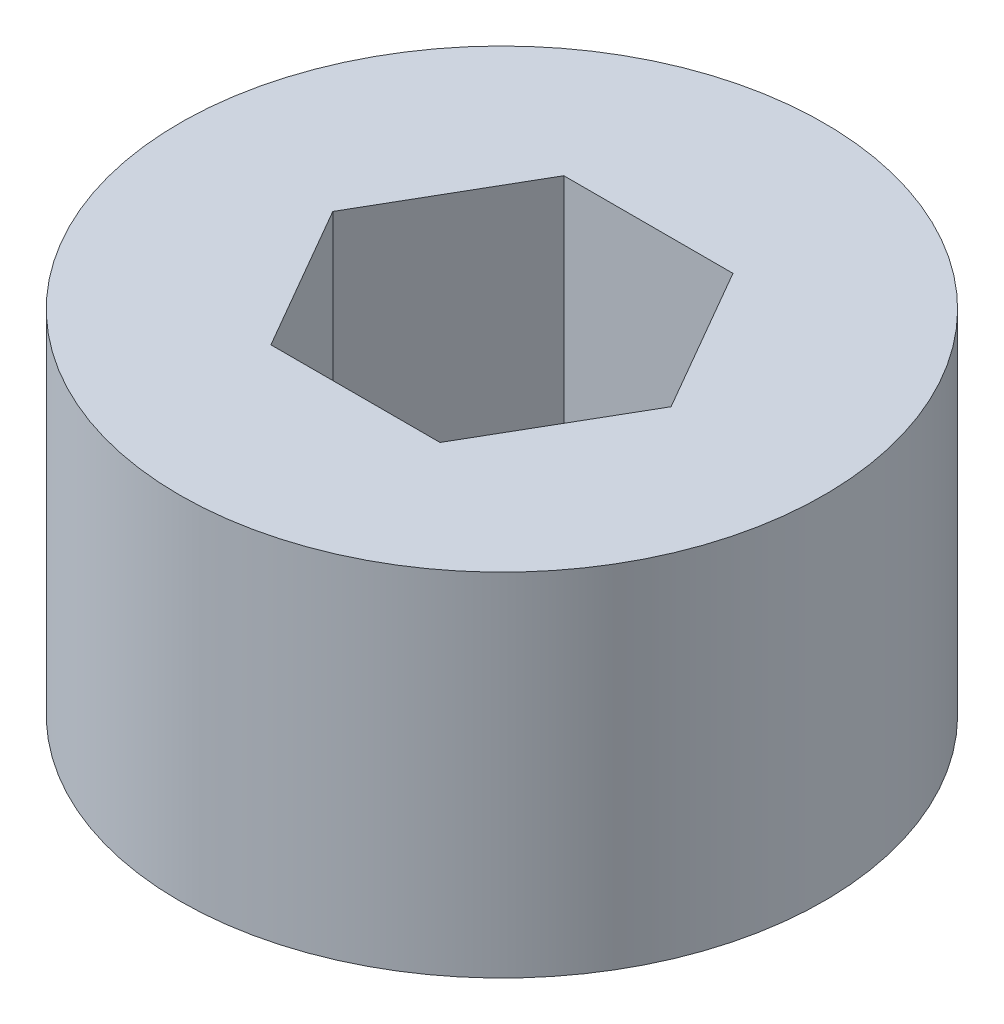
ISO-10303-21;
HEADER;
FILE_DESCRIPTION(('STEP AP214'),'2;1');
FILE_NAME('part.step','',(''),(''),'','','');
FILE_SCHEMA(('AUTOMOTIVE_DESIGN { 1 0 10303 214 1 1 1 1 }'));
ENDSEC;
DATA;
#1=APPLICATION_CONTEXT('core data for automotive mechanical design processes');
#2=APPLICATION_PROTOCOL_DEFINITION('international standard','automotive_design',2000,#1);
#3=PRODUCT_CONTEXT('',#1,'mechanical');
#4=PRODUCT('Part','Part','',(#3));
#5=PRODUCT_RELATED_PRODUCT_CATEGORY('part','',(#4));
#6=PRODUCT_DEFINITION_FORMATION('','',#4);
#7=PRODUCT_DEFINITION_CONTEXT('part definition',#1,'design');
#8=PRODUCT_DEFINITION('design','',#6,#7);
#9=PRODUCT_DEFINITION_SHAPE('','',#8);
#10=(LENGTH_UNIT() NAMED_UNIT(*) SI_UNIT(.MILLI.,.METRE.));
#11=(NAMED_UNIT(*) PLANE_ANGLE_UNIT() SI_UNIT($,.RADIAN.));
#12=(NAMED_UNIT(*) SI_UNIT($,.STERADIAN.) SOLID_ANGLE_UNIT());
#13=UNCERTAINTY_MEASURE_WITH_UNIT(LENGTH_MEASURE(1.E-05),#10,'distance_accuracy_value','');
#14=(GEOMETRIC_REPRESENTATION_CONTEXT(3) GLOBAL_UNCERTAINTY_ASSIGNED_CONTEXT((#13)) GLOBAL_UNIT_ASSIGNED_CONTEXT((#10,
#11,#12)) REPRESENTATION_CONTEXT('',''));
#15=CARTESIAN_POINT('',(0.,0.,0.));
#16=DIRECTION('',(0.,0.,1.));
#17=DIRECTION('',(1.,0.,0.));
#18=AXIS2_PLACEMENT_3D('',#15,#16,#17);
#19=CARTESIAN_POINT('',(0.,3.,0.));
#20=DIRECTION('',(0.,1.,0.));
#21=DIRECTION('',(0.,0.,1.));
#22=AXIS2_PLACEMENT_3D('',#19,#20,#21);
#23=PLANE('',#22);
#24=CARTESIAN_POINT('',(0.,3.,0.));
#25=DIRECTION('',(0.,1.,0.));
#26=DIRECTION('',(0.,0.,1.));
#27=AXIS2_PLACEMENT_3D('',#24,#25,#26);
#28=CIRCLE('',#27,2.75);
#29=CARTESIAN_POINT('',(0.,3.,2.75));
#30=VERTEX_POINT('',#29);
#31=EDGE_CURVE('E11',#30,#30,#28,.T.);
#32=ORIENTED_EDGE('',*,*,#31,.T.);
#33=EDGE_LOOP('',(#32));
#34=FACE_BOUND('',#33,.T.);
#35=DIRECTION('',(1.,0.,0.));
#36=VECTOR('',#35,1.);
#37=CARTESIAN_POINT('',(0.,3.,-1.25));
#38=LINE('',#37,#36);
#39=CARTESIAN_POINT('',(-0.721687836487033,3.,-1.25));
#40=VERTEX_POINT('',#39);
#41=CARTESIAN_POINT('',(0.721687836487032,3.,-1.25));
#42=VERTEX_POINT('',#41);
#43=EDGE_CURVE('E146',#40,#42,#38,.T.);
#44=ORIENTED_EDGE('',*,*,#43,.T.);
#45=DIRECTION('',(0.5,0.,0.866025403784439));
#46=VECTOR('',#45,1.);
#47=CARTESIAN_POINT('',(1.08253175473055,3.,-0.625));
#48=LINE('',#47,#46);
#49=CARTESIAN_POINT('',(1.44337567297406,3.,0.));
#50=VERTEX_POINT('',#49);
#51=EDGE_CURVE('E99',#42,#50,#48,.T.);
#52=ORIENTED_EDGE('',*,*,#51,.T.);
#53=DIRECTION('',(-0.5,0.,0.866025403784439));
#54=VECTOR('',#53,1.);
#55=CARTESIAN_POINT('',(1.08253175473055,3.,0.625));
#56=LINE('',#55,#54);
#57=CARTESIAN_POINT('',(0.721687836487032,3.,1.25));
#58=VERTEX_POINT('',#57);
#59=EDGE_CURVE('E102',#50,#58,#56,.T.);
#60=ORIENTED_EDGE('',*,*,#59,.T.);
#61=DIRECTION('',(-1.,0.,0.));
#62=VECTOR('',#61,1.);
#63=CARTESIAN_POINT('',(0.,3.,1.25));
#64=LINE('',#63,#62);
#65=CARTESIAN_POINT('',(-0.721687836487032,3.,1.25));
#66=VERTEX_POINT('',#65);
#67=EDGE_CURVE('E137',#58,#66,#64,.T.);
#68=ORIENTED_EDGE('',*,*,#67,.T.);
#69=DIRECTION('',(-0.5,0.,-0.866025403784439));
#70=VECTOR('',#69,1.);
#71=CARTESIAN_POINT('',(-1.08253175473055,3.,0.625));
#72=LINE('',#71,#70);
#73=CARTESIAN_POINT('',(-1.44337567297406,3.,0.));
#74=VERTEX_POINT('',#73);
#75=EDGE_CURVE('E140',#66,#74,#72,.T.);
#76=ORIENTED_EDGE('',*,*,#75,.T.);
#77=DIRECTION('',(0.5,0.,-0.866025403784439));
#78=VECTOR('',#77,1.);
#79=CARTESIAN_POINT('',(-1.08253175473055,3.,-0.625));
#80=LINE('',#79,#78);
#81=EDGE_CURVE('E143',#74,#40,#80,.T.);
#82=ORIENTED_EDGE('',*,*,#81,.T.);
#83=EDGE_LOOP('',(#44,#52,#60,#68,#76,#82));
#84=FACE_BOUND('',#83,.T.);
#85=ADVANCED_FACE('F43',(#34,#84),#23,.T.);
#86=CARTESIAN_POINT('',(0.,0.,0.));
#87=DIRECTION('',(0.,1.,0.));
#88=DIRECTION('',(0.,0.,1.));
#89=AXIS2_PLACEMENT_3D('',#86,#87,#88);
#90=PLANE('',#89);
#91=CARTESIAN_POINT('',(0.,0.,0.));
#92=DIRECTION('',(0.,1.,0.));
#93=DIRECTION('',(0.,0.,1.));
#94=AXIS2_PLACEMENT_3D('',#91,#92,#93);
#95=CIRCLE('',#94,2.75);
#96=CARTESIAN_POINT('',(0.,0.,2.75));
#97=VERTEX_POINT('',#96);
#98=EDGE_CURVE('E47',#97,#97,#95,.T.);
#99=ORIENTED_EDGE('',*,*,#98,.F.);
#100=EDGE_LOOP('',(#99));
#101=FACE_BOUND('',#100,.T.);
#102=DIRECTION('',(-0.5,0.,-0.866025403784439));
#103=VECTOR('',#102,1.);
#104=CARTESIAN_POINT('',(1.44337567297406,0.,0.));
#105=LINE('',#104,#103);
#106=CARTESIAN_POINT('',(1.44337567297406,0.,0.));
#107=VERTEX_POINT('',#106);
#108=CARTESIAN_POINT('',(0.721687836487032,0.,-1.25));
#109=VERTEX_POINT('',#108);
#110=EDGE_CURVE('E66',#107,#109,#105,.T.);
#111=ORIENTED_EDGE('',*,*,#110,.T.);
#112=DIRECTION('',(-1.,0.,0.));
#113=VECTOR('',#112,1.);
#114=CARTESIAN_POINT('',(0.721687836487032,0.,-1.25));
#115=LINE('',#114,#113);
#116=CARTESIAN_POINT('',(-0.721687836487033,0.,-1.25));
#117=VERTEX_POINT('',#116);
#118=EDGE_CURVE('E106',#109,#117,#115,.T.);
#119=ORIENTED_EDGE('',*,*,#118,.T.);
#120=DIRECTION('',(-0.5,0.,0.866025403784439));
#121=VECTOR('',#120,1.);
#122=CARTESIAN_POINT('',(-0.721687836487033,0.,-1.25));
#123=LINE('',#122,#121);
#124=CARTESIAN_POINT('',(-1.44337567297406,0.,0.));
#125=VERTEX_POINT('',#124);
#126=EDGE_CURVE('E112',#117,#125,#123,.T.);
#127=ORIENTED_EDGE('',*,*,#126,.T.);
#128=DIRECTION('',(0.5,0.,0.866025403784438));
#129=VECTOR('',#128,1.);
#130=CARTESIAN_POINT('',(-1.44337567297406,0.,0.));
#131=LINE('',#130,#129);
#132=CARTESIAN_POINT('',(-0.721687836487032,0.,1.25));
#133=VERTEX_POINT('',#132);
#134=EDGE_CURVE('E121',#125,#133,#131,.T.);
#135=ORIENTED_EDGE('',*,*,#134,.T.);
#136=DIRECTION('',(1.,0.,0.));
#137=VECTOR('',#136,1.);
#138=CARTESIAN_POINT('',(-0.721687836487032,0.,1.25));
#139=LINE('',#138,#137);
#140=CARTESIAN_POINT('',(0.721687836487032,0.,1.25));
#141=VERTEX_POINT('',#140);
#142=EDGE_CURVE('E124',#133,#141,#139,.T.);
#143=ORIENTED_EDGE('',*,*,#142,.T.);
#144=DIRECTION('',(0.5,0.,-0.866025403784439));
#145=VECTOR('',#144,1.);
#146=CARTESIAN_POINT('',(0.721687836487032,0.,1.25));
#147=LINE('',#146,#145);
#148=EDGE_CURVE('E117',#141,#107,#147,.T.);
#149=ORIENTED_EDGE('',*,*,#148,.T.);
#150=EDGE_LOOP('',(#111,#119,#127,#135,#143,#149));
#151=FACE_BOUND('',#150,.T.);
#152=ADVANCED_FACE('F115',(#101,#151),#90,.F.);
#153=CARTESIAN_POINT('',(0.,3.,0.));
#154=DIRECTION('',(0.,-1.,0.));
#155=DIRECTION('',(0.,0.,-1.));
#156=AXIS2_PLACEMENT_3D('',#153,#154,#155);
#157=CYLINDRICAL_SURFACE('',#156,2.75);
#158=ORIENTED_EDGE('',*,*,#31,.F.);
#159=EDGE_LOOP('',(#158));
#160=FACE_BOUND('',#159,.T.);
#161=ORIENTED_EDGE('',*,*,#98,.T.);
#162=EDGE_LOOP('',(#161));
#163=FACE_BOUND('',#162,.T.);
#164=ADVANCED_FACE('F45',(#160,#163),#157,.T.);
#165=CARTESIAN_POINT('',(1.44337567297406,3.98112194679521,0.));
#166=DIRECTION('',(-0.866025403784439,0.,0.5));
#167=DIRECTION('',(0.5,0.,0.866025403784439));
#168=AXIS2_PLACEMENT_3D('',#165,#166,#167);
#169=PLANE('',#168);
#170=DIRECTION('',(0.,-1.,0.));
#171=VECTOR('',#170,1.);
#172=CARTESIAN_POINT('',(0.721687836487032,3.98112194679521,-1.25));
#173=LINE('',#172,#171);
#174=EDGE_CURVE('E95',#42,#109,#173,.T.);
#175=ORIENTED_EDGE('',*,*,#174,.T.);
#176=ORIENTED_EDGE('',*,*,#110,.F.);
#177=DIRECTION('',(0.,-1.,0.));
#178=VECTOR('',#177,1.);
#179=CARTESIAN_POINT('',(1.44337567297406,3.98112194679521,0.));
#180=LINE('',#179,#178);
#181=EDGE_CURVE('E127',#50,#107,#180,.T.);
#182=ORIENTED_EDGE('',*,*,#181,.F.);
#183=ORIENTED_EDGE('',*,*,#51,.F.);
#184=EDGE_LOOP('',(#175,#176,#182,#183));
#185=FACE_BOUND('',#184,.T.);
#186=ADVANCED_FACE('F97',(#185),#169,.T.);
#187=CARTESIAN_POINT('',(0.721687836487032,3.98112194679521,-1.25));
#188=DIRECTION('',(0.,0.,1.));
#189=DIRECTION('',(1.,0.,0.));
#190=AXIS2_PLACEMENT_3D('',#187,#188,#189);
#191=PLANE('',#190);
#192=DIRECTION('',(0.,-1.,0.));
#193=VECTOR('',#192,1.);
#194=CARTESIAN_POINT('',(-0.721687836487033,3.98112194679521,-1.25));
#195=LINE('',#194,#193);
#196=EDGE_CURVE('E103',#40,#117,#195,.T.);
#197=ORIENTED_EDGE('',*,*,#196,.T.);
#198=ORIENTED_EDGE('',*,*,#118,.F.);
#199=ORIENTED_EDGE('',*,*,#174,.F.);
#200=ORIENTED_EDGE('',*,*,#43,.F.);
#201=EDGE_LOOP('',(#197,#198,#199,#200));
#202=FACE_BOUND('',#201,.T.);
#203=ADVANCED_FACE('F107',(#202),#191,.T.);
#204=CARTESIAN_POINT('',(-0.721687836487033,3.98112194679521,-1.25));
#205=DIRECTION('',(0.866025403784439,0.,0.5));
#206=DIRECTION('',(0.5,0.,-0.866025403784439));
#207=AXIS2_PLACEMENT_3D('',#204,#205,#206);
#208=PLANE('',#207);
#209=DIRECTION('',(0.,-1.,0.));
#210=VECTOR('',#209,1.);
#211=CARTESIAN_POINT('',(-1.44337567297406,3.98112194679521,0.));
#212=LINE('',#211,#210);
#213=EDGE_CURVE('E132',#74,#125,#212,.T.);
#214=ORIENTED_EDGE('',*,*,#213,.T.);
#215=ORIENTED_EDGE('',*,*,#126,.F.);
#216=ORIENTED_EDGE('',*,*,#196,.F.);
#217=ORIENTED_EDGE('',*,*,#81,.F.);
#218=EDGE_LOOP('',(#214,#215,#216,#217));
#219=FACE_BOUND('',#218,.T.);
#220=ADVANCED_FACE('F166',(#219),#208,.T.);
#221=CARTESIAN_POINT('',(-1.44337567297406,3.98112194679521,0.));
#222=DIRECTION('',(0.866025403784438,0.,-0.5));
#223=DIRECTION('',(-0.5,0.,-0.866025403784439));
#224=AXIS2_PLACEMENT_3D('',#221,#222,#223);
#225=PLANE('',#224);
#226=DIRECTION('',(0.,-1.,0.));
#227=VECTOR('',#226,1.);
#228=CARTESIAN_POINT('',(-0.721687836487032,3.98112194679521,1.25));
#229=LINE('',#228,#227);
#230=EDGE_CURVE('E130',#66,#133,#229,.T.);
#231=ORIENTED_EDGE('',*,*,#230,.T.);
#232=ORIENTED_EDGE('',*,*,#134,.F.);
#233=ORIENTED_EDGE('',*,*,#213,.F.);
#234=ORIENTED_EDGE('',*,*,#75,.F.);
#235=EDGE_LOOP('',(#231,#232,#233,#234));
#236=FACE_BOUND('',#235,.T.);
#237=ADVANCED_FACE('F169',(#236),#225,.T.);
#238=CARTESIAN_POINT('',(-0.721687836487032,3.98112194679521,1.25));
#239=DIRECTION('',(0.,0.,-1.));
#240=DIRECTION('',(-1.,0.,0.));
#241=AXIS2_PLACEMENT_3D('',#238,#239,#240);
#242=PLANE('',#241);
#243=DIRECTION('',(0.,-1.,0.));
#244=VECTOR('',#243,1.);
#245=CARTESIAN_POINT('',(0.721687836487032,3.98112194679521,1.25));
#246=LINE('',#245,#244);
#247=EDGE_CURVE('E58',#58,#141,#246,.T.);
#248=ORIENTED_EDGE('',*,*,#247,.T.);
#249=ORIENTED_EDGE('',*,*,#142,.F.);
#250=ORIENTED_EDGE('',*,*,#230,.F.);
#251=ORIENTED_EDGE('',*,*,#67,.F.);
#252=EDGE_LOOP('',(#248,#249,#250,#251));
#253=FACE_BOUND('',#252,.T.);
#254=ADVANCED_FACE('F173',(#253),#242,.T.);
#255=CARTESIAN_POINT('',(0.721687836487032,3.98112194679521,1.25));
#256=DIRECTION('',(-0.866025403784439,0.,-0.5));
#257=DIRECTION('',(-0.5,0.,0.866025403784439));
#258=AXIS2_PLACEMENT_3D('',#255,#256,#257);
#259=PLANE('',#258);
#260=ORIENTED_EDGE('',*,*,#181,.T.);
#261=ORIENTED_EDGE('',*,*,#148,.F.);
#262=ORIENTED_EDGE('',*,*,#247,.F.);
#263=ORIENTED_EDGE('',*,*,#59,.F.);
#264=EDGE_LOOP('',(#260,#261,#262,#263));
#265=FACE_BOUND('',#264,.T.);
#266=ADVANCED_FACE('F177',(#265),#259,.T.);
#267=CLOSED_SHELL('',(#85,#152,#164,#186,#203,#220,#237,#254,#266));
#268=MANIFOLD_SOLID_BREP('B2',#267);
#269=ADVANCED_BREP_SHAPE_REPRESENTATION('',(#18,#268),#14);
#270=SHAPE_DEFINITION_REPRESENTATION(#9,#269);
ENDSEC;
END-ISO-10303-21;
